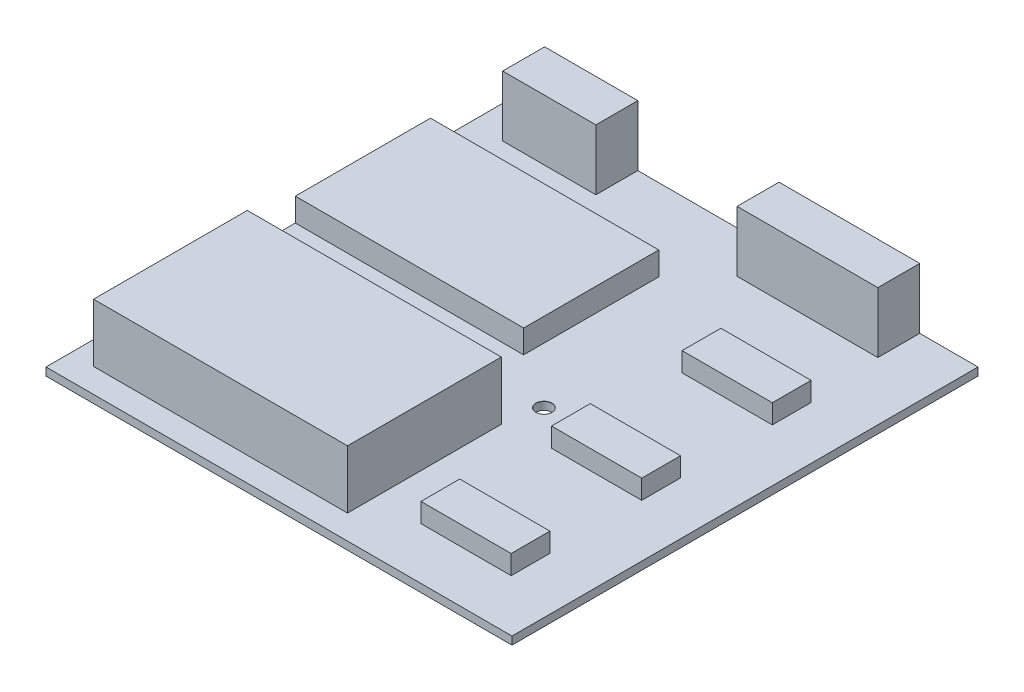
ISO-10303-21;
HEADER;
FILE_DESCRIPTION(('STEP AP214'),'2;1');
FILE_NAME('part.step','',(''),(''),'','','');
FILE_SCHEMA(('AUTOMOTIVE_DESIGN { 1 0 10303 214 1 1 1 1 }'));
ENDSEC;
DATA;
#1=APPLICATION_CONTEXT('core data for automotive mechanical design processes');
#2=APPLICATION_PROTOCOL_DEFINITION('international standard','automotive_design',2000,#1);
#3=PRODUCT_CONTEXT('',#1,'mechanical');
#4=PRODUCT('Part','Part','',(#3));
#5=PRODUCT_RELATED_PRODUCT_CATEGORY('part','',(#4));
#6=PRODUCT_DEFINITION_FORMATION('','',#4);
#7=PRODUCT_DEFINITION_CONTEXT('part definition',#1,'design');
#8=PRODUCT_DEFINITION('design','',#6,#7);
#9=PRODUCT_DEFINITION_SHAPE('','',#8);
#10=(LENGTH_UNIT() NAMED_UNIT(*) SI_UNIT(.MILLI.,.METRE.));
#11=(NAMED_UNIT(*) PLANE_ANGLE_UNIT() SI_UNIT($,.RADIAN.));
#12=(NAMED_UNIT(*) SI_UNIT($,.STERADIAN.) SOLID_ANGLE_UNIT());
#13=UNCERTAINTY_MEASURE_WITH_UNIT(LENGTH_MEASURE(1.E-05),#10,'distance_accuracy_value','');
#14=(GEOMETRIC_REPRESENTATION_CONTEXT(3) GLOBAL_UNCERTAINTY_ASSIGNED_CONTEXT((#13)) GLOBAL_UNIT_ASSIGNED_CONTEXT((#10,
#11,#12)) REPRESENTATION_CONTEXT('',''));
#15=CARTESIAN_POINT('',(0.,0.,0.));
#16=DIRECTION('',(0.,0.,1.));
#17=DIRECTION('',(1.,0.,0.));
#18=AXIS2_PLACEMENT_3D('',#15,#16,#17);
#19=CARTESIAN_POINT('',(0.,1.7,0.));
#20=DIRECTION('',(0.,-1.,0.));
#21=DIRECTION('',(0.,0.,-1.));
#22=AXIS2_PLACEMENT_3D('',#19,#20,#21);
#23=PLANE('',#22);
#24=CARTESIAN_POINT('',(-37.,1.7,4.15));
#25=DIRECTION('',(0.,1.,0.));
#26=DIRECTION('',(0.,0.,1.));
#27=AXIS2_PLACEMENT_3D('',#24,#25,#26);
#28=CIRCLE('',#27,1.725);
#29=CARTESIAN_POINT('',(-37.,1.7,5.875));
#30=VERTEX_POINT('',#29);
#31=EDGE_CURVE('E890',#30,#30,#28,.T.);
#32=ORIENTED_EDGE('',*,*,#31,.F.);
#33=EDGE_LOOP('',(#32));
#34=FACE_BOUND('',#33,.T.);
#35=CARTESIAN_POINT('',(11.,1.7,4.15));
#36=DIRECTION('',(0.,1.,0.));
#37=DIRECTION('',(0.,0.,1.));
#38=AXIS2_PLACEMENT_3D('',#35,#36,#37);
#39=CIRCLE('',#38,1.725);
#40=CARTESIAN_POINT('',(11.,1.7,5.875));
#41=VERTEX_POINT('',#40);
#42=EDGE_CURVE('E897',#41,#41,#39,.T.);
#43=ORIENTED_EDGE('',*,*,#42,.F.);
#44=EDGE_LOOP('',(#43));
#45=FACE_BOUND('',#44,.T.);
#46=DIRECTION('',(0.,0.,1.));
#47=VECTOR('',#46,1.);
#48=CARTESIAN_POINT('',(19.34,1.7,30.56));
#49=LINE('',#48,#47);
#50=CARTESIAN_POINT('',(19.34,1.7,30.56));
#51=VERTEX_POINT('',#50);
#52=CARTESIAN_POINT('',(19.34,1.7,38.88));
#53=VERTEX_POINT('',#52);
#54=EDGE_CURVE('E263',#51,#53,#49,.T.);
#55=ORIENTED_EDGE('',*,*,#54,.F.);
#56=DIRECTION('',(-1.,0.,0.));
#57=VECTOR('',#56,1.);
#58=CARTESIAN_POINT('',(19.34,1.7,30.56));
#59=LINE('',#58,#57);
#60=CARTESIAN_POINT('',(38.7,1.7,30.56));
#61=VERTEX_POINT('',#60);
#62=EDGE_CURVE('E276',#61,#51,#59,.T.);
#63=ORIENTED_EDGE('',*,*,#62,.F.);
#64=DIRECTION('',(0.,0.,-1.));
#65=VECTOR('',#64,1.);
#66=CARTESIAN_POINT('',(38.7,1.7,30.56));
#67=LINE('',#66,#65);
#68=CARTESIAN_POINT('',(38.7,1.7,38.88));
#69=VERTEX_POINT('',#68);
#70=EDGE_CURVE('E285',#69,#61,#67,.T.);
#71=ORIENTED_EDGE('',*,*,#70,.F.);
#72=DIRECTION('',(1.,0.,0.));
#73=VECTOR('',#72,1.);
#74=CARTESIAN_POINT('',(19.34,1.7,38.88));
#75=LINE('',#74,#73);
#76=EDGE_CURVE('E266',#53,#69,#75,.T.);
#77=ORIENTED_EDGE('',*,*,#76,.F.);
#78=EDGE_LOOP('',(#55,#63,#71,#77));
#79=FACE_BOUND('',#78,.T.);
#80=DIRECTION('',(0.,0.,1.));
#81=VECTOR('',#80,1.);
#82=CARTESIAN_POINT('',(19.34,1.7,-25.48));
#83=LINE('',#82,#81);
#84=CARTESIAN_POINT('',(19.34,1.7,-25.48));
#85=VERTEX_POINT('',#84);
#86=CARTESIAN_POINT('',(19.34,1.7,-17.16));
#87=VERTEX_POINT('',#86);
#88=EDGE_CURVE('E334',#85,#87,#83,.T.);
#89=ORIENTED_EDGE('',*,*,#88,.F.);
#90=DIRECTION('',(-1.,0.,0.));
#91=VECTOR('',#90,1.);
#92=CARTESIAN_POINT('',(19.34,1.7,-25.48));
#93=LINE('',#92,#91);
#94=CARTESIAN_POINT('',(38.7,1.7,-25.48));
#95=VERTEX_POINT('',#94);
#96=EDGE_CURVE('E339',#95,#85,#93,.T.);
#97=ORIENTED_EDGE('',*,*,#96,.F.);
#98=DIRECTION('',(0.,0.,-1.));
#99=VECTOR('',#98,1.);
#100=CARTESIAN_POINT('',(38.7,1.7,-25.48));
#101=LINE('',#100,#99);
#102=CARTESIAN_POINT('',(38.7,1.7,-17.16));
#103=VERTEX_POINT('',#102);
#104=EDGE_CURVE('E351',#103,#95,#101,.T.);
#105=ORIENTED_EDGE('',*,*,#104,.F.);
#106=DIRECTION('',(1.,0.,0.));
#107=VECTOR('',#106,1.);
#108=CARTESIAN_POINT('',(19.34,1.7,-17.16));
#109=LINE('',#108,#107);
#110=EDGE_CURVE('E348',#87,#103,#109,.T.);
#111=ORIENTED_EDGE('',*,*,#110,.F.);
#112=EDGE_LOOP('',(#89,#97,#105,#111));
#113=FACE_BOUND('',#112,.T.);
#114=DIRECTION('',(1.,0.,0.));
#115=VECTOR('',#114,1.);
#116=CARTESIAN_POINT('',(-50.,1.7,-3.5));
#117=LINE('',#116,#115);
#118=CARTESIAN_POINT('',(-50.,1.7,-3.5));
#119=VERTEX_POINT('',#118);
#120=CARTESIAN_POINT('',(-0.999999999999984,1.7,-3.5));
#121=VERTEX_POINT('',#120);
#122=EDGE_CURVE('E367',#119,#121,#117,.T.);
#123=ORIENTED_EDGE('',*,*,#122,.F.);
#124=DIRECTION('',(0.,0.,1.));
#125=VECTOR('',#124,1.);
#126=CARTESIAN_POINT('',(-50.,1.7,50.));
#127=LINE('',#126,#125);
#128=CARTESIAN_POINT('',(-50.,1.7,50.));
#129=VERTEX_POINT('',#128);
#130=EDGE_CURVE('E465',#119,#129,#127,.T.);
#131=ORIENTED_EDGE('',*,*,#130,.T.);
#132=DIRECTION('',(1.,0.,0.));
#133=VECTOR('',#132,1.);
#134=CARTESIAN_POINT('',(-50.,1.7,50.));
#135=LINE('',#134,#133);
#136=CARTESIAN_POINT('',(50.,1.7,50.));
#137=VERTEX_POINT('',#136);
#138=EDGE_CURVE('E469',#129,#137,#135,.T.);
#139=ORIENTED_EDGE('',*,*,#138,.T.);
#140=DIRECTION('',(0.,0.,-1.));
#141=VECTOR('',#140,1.);
#142=CARTESIAN_POINT('',(50.,1.7,50.));
#143=LINE('',#142,#141);
#144=CARTESIAN_POINT('',(50.,1.7,-50.));
#145=VERTEX_POINT('',#144);
#146=EDGE_CURVE('E458',#137,#145,#143,.T.);
#147=ORIENTED_EDGE('',*,*,#146,.T.);
#148=DIRECTION('',(-1.,0.,0.));
#149=VECTOR('',#148,1.);
#150=CARTESIAN_POINT('',(-50.,1.7,-50.));
#151=LINE('',#150,#149);
#152=CARTESIAN_POINT('',(37.5,1.7,-50.));
#153=VERTEX_POINT('',#152);
#154=EDGE_CURVE('E463',#145,#153,#151,.T.);
#155=ORIENTED_EDGE('',*,*,#154,.T.);
#156=DIRECTION('',(0.,0.,-1.));
#157=VECTOR('',#156,1.);
#158=CARTESIAN_POINT('',(37.5,1.7,-50.));
#159=LINE('',#158,#157);
#160=CARTESIAN_POINT('',(37.5,1.7,-41.));
#161=VERTEX_POINT('',#160);
#162=EDGE_CURVE('E432',#161,#153,#159,.T.);
#163=ORIENTED_EDGE('',*,*,#162,.F.);
#164=DIRECTION('',(1.,0.,0.));
#165=VECTOR('',#164,1.);
#166=CARTESIAN_POINT('',(7.30000000000002,1.7,-41.));
#167=LINE('',#166,#165);
#168=CARTESIAN_POINT('',(7.30000000000002,1.7,-41.));
#169=VERTEX_POINT('',#168);
#170=EDGE_CURVE('E441',#169,#161,#167,.T.);
#171=ORIENTED_EDGE('',*,*,#170,.F.);
#172=DIRECTION('',(0.,0.,1.));
#173=VECTOR('',#172,1.);
#174=CARTESIAN_POINT('',(7.30000000000002,1.7,-50.));
#175=LINE('',#174,#173);
#176=CARTESIAN_POINT('',(7.30000000000002,1.7,-50.));
#177=VERTEX_POINT('',#176);
#178=EDGE_CURVE('E427',#177,#169,#175,.T.);
#179=ORIENTED_EDGE('',*,*,#178,.F.);
#180=CARTESIAN_POINT('',(-23.,1.7,-50.));
#181=VERTEX_POINT('',#180);
#182=EDGE_CURVE('E466',#177,#181,#151,.T.);
#183=ORIENTED_EDGE('',*,*,#182,.T.);
#184=DIRECTION('',(0.,0.,-1.));
#185=VECTOR('',#184,1.);
#186=CARTESIAN_POINT('',(-23.,1.7,-50.));
#187=LINE('',#186,#185);
#188=CARTESIAN_POINT('',(-23.,1.7,-41.));
#189=VERTEX_POINT('',#188);
#190=EDGE_CURVE('E402',#189,#181,#187,.T.);
#191=ORIENTED_EDGE('',*,*,#190,.F.);
#192=DIRECTION('',(1.,0.,0.));
#193=VECTOR('',#192,1.);
#194=CARTESIAN_POINT('',(-43.,1.7,-41.));
#195=LINE('',#194,#193);
#196=CARTESIAN_POINT('',(-43.,1.7,-41.));
#197=VERTEX_POINT('',#196);
#198=EDGE_CURVE('E411',#197,#189,#195,.T.);
#199=ORIENTED_EDGE('',*,*,#198,.F.);
#200=DIRECTION('',(0.,0.,1.));
#201=VECTOR('',#200,1.);
#202=CARTESIAN_POINT('',(-43.,1.7,-50.));
#203=LINE('',#202,#201);
#204=CARTESIAN_POINT('',(-43.,1.7,-50.));
#205=VERTEX_POINT('',#204);
#206=EDGE_CURVE('E397',#205,#197,#203,.T.);
#207=ORIENTED_EDGE('',*,*,#206,.F.);
#208=CARTESIAN_POINT('',(-50.,1.7,-50.));
#209=VERTEX_POINT('',#208);
#210=EDGE_CURVE('E461',#205,#209,#151,.T.);
#211=ORIENTED_EDGE('',*,*,#210,.T.);
#212=CARTESIAN_POINT('',(-50.,1.7,-32.5));
#213=VERTEX_POINT('',#212);
#214=EDGE_CURVE('E467',#209,#213,#127,.T.);
#215=ORIENTED_EDGE('',*,*,#214,.T.);
#216=DIRECTION('',(-1.,0.,0.));
#217=VECTOR('',#216,1.);
#218=CARTESIAN_POINT('',(-50.,1.7,-32.5));
#219=LINE('',#218,#217);
#220=CARTESIAN_POINT('',(-0.999999999999987,1.7,-32.5));
#221=VERTEX_POINT('',#220);
#222=EDGE_CURVE('E372',#221,#213,#219,.T.);
#223=ORIENTED_EDGE('',*,*,#222,.F.);
#224=DIRECTION('',(0.,0.,-1.));
#225=VECTOR('',#224,1.);
#226=CARTESIAN_POINT('',(-0.999999999999987,1.7,-32.5));
#227=LINE('',#226,#225);
#228=EDGE_CURVE('E381',#121,#221,#227,.T.);
#229=ORIENTED_EDGE('',*,*,#228,.F.);
#230=EDGE_LOOP('',(#123,#131,#139,#147,#155,#163,#171,#179,#183,#191,#199,#207,#211,#215,#223,#229));
#231=FACE_BOUND('',#230,.T.);
#232=DIRECTION('',(0.,0.,1.));
#233=VECTOR('',#232,1.);
#234=CARTESIAN_POINT('',(19.34,1.7,10.86));
#235=LINE('',#234,#233);
#236=CARTESIAN_POINT('',(19.34,1.7,2.54));
#237=VERTEX_POINT('',#236);
#238=CARTESIAN_POINT('',(19.34,1.7,10.86));
#239=VERTEX_POINT('',#238);
#240=EDGE_CURVE('E301',#237,#239,#235,.T.);
#241=ORIENTED_EDGE('',*,*,#240,.F.);
#242=DIRECTION('',(-1.,0.,0.));
#243=VECTOR('',#242,1.);
#244=CARTESIAN_POINT('',(19.34,1.7,2.54));
#245=LINE('',#244,#243);
#246=CARTESIAN_POINT('',(38.7,1.7,2.54));
#247=VERTEX_POINT('',#246);
#248=EDGE_CURVE('E306',#247,#237,#245,.T.);
#249=ORIENTED_EDGE('',*,*,#248,.F.);
#250=DIRECTION('',(0.,0.,-1.));
#251=VECTOR('',#250,1.);
#252=CARTESIAN_POINT('',(38.7,1.7,10.86));
#253=LINE('',#252,#251);
#254=CARTESIAN_POINT('',(38.7,1.7,10.86));
#255=VERTEX_POINT('',#254);
#256=EDGE_CURVE('E318',#255,#247,#253,.T.);
#257=ORIENTED_EDGE('',*,*,#256,.F.);
#258=DIRECTION('',(1.,0.,0.));
#259=VECTOR('',#258,1.);
#260=CARTESIAN_POINT('',(19.34,1.7,10.86));
#261=LINE('',#260,#259);
#262=EDGE_CURVE('E315',#239,#255,#261,.T.);
#263=ORIENTED_EDGE('',*,*,#262,.F.);
#264=EDGE_LOOP('',(#241,#249,#257,#263));
#265=FACE_BOUND('',#264,.T.);
#266=DIRECTION('',(0.,0.,1.));
#267=VECTOR('',#266,1.);
#268=CARTESIAN_POINT('',(-45.,1.7,11.8));
#269=LINE('',#268,#267);
#270=CARTESIAN_POINT('',(-45.,1.7,11.8));
#271=VERTEX_POINT('',#270);
#272=CARTESIAN_POINT('',(-45.,1.7,44.8));
#273=VERTEX_POINT('',#272);
#274=EDGE_CURVE('E262',#271,#273,#269,.T.);
#275=ORIENTED_EDGE('',*,*,#274,.F.);
#276=DIRECTION('',(-1.,0.,0.));
#277=VECTOR('',#276,1.);
#278=CARTESIAN_POINT('',(-45.,1.7,11.8));
#279=LINE('',#278,#277);
#280=CARTESIAN_POINT('',(9.50000000000002,1.7,11.8));
#281=VERTEX_POINT('',#280);
#282=EDGE_CURVE('E259',#281,#271,#279,.T.);
#283=ORIENTED_EDGE('',*,*,#282,.F.);
#284=DIRECTION('',(0.,0.,-1.));
#285=VECTOR('',#284,1.);
#286=CARTESIAN_POINT('',(9.50000000000002,1.7,11.8));
#287=LINE('',#286,#285);
#288=CARTESIAN_POINT('',(9.50000000000002,1.7,44.8));
#289=VERTEX_POINT('',#288);
#290=EDGE_CURVE('E53',#289,#281,#287,.T.);
#291=ORIENTED_EDGE('',*,*,#290,.F.);
#292=DIRECTION('',(1.,0.,0.));
#293=VECTOR('',#292,1.);
#294=CARTESIAN_POINT('',(-45.,1.7,44.8));
#295=LINE('',#294,#293);
#296=EDGE_CURVE('E48',#273,#289,#295,.T.);
#297=ORIENTED_EDGE('',*,*,#296,.F.);
#298=EDGE_LOOP('',(#275,#283,#291,#297));
#299=FACE_BOUND('',#298,.T.);
#300=ADVANCED_FACE('F33',(#34,#45,#79,#113,#231,#265,#299),#23,.F.);
#301=CARTESIAN_POINT('',(50.,1.7,50.));
#302=DIRECTION('',(-1.,0.,0.));
#303=DIRECTION('',(0.,0.,1.));
#304=AXIS2_PLACEMENT_3D('',#301,#302,#303);
#305=PLANE('',#304);
#306=DIRECTION('',(0.,0.,-1.));
#307=VECTOR('',#306,1.);
#308=CARTESIAN_POINT('',(50.,0.,50.));
#309=LINE('',#308,#307);
#310=CARTESIAN_POINT('',(50.,0.,50.));
#311=VERTEX_POINT('',#310);
#312=CARTESIAN_POINT('',(50.,0.,-50.));
#313=VERTEX_POINT('',#312);
#314=EDGE_CURVE('E457',#311,#313,#309,.T.);
#315=ORIENTED_EDGE('',*,*,#314,.T.);
#316=DIRECTION('',(0.,-1.,0.));
#317=VECTOR('',#316,1.);
#318=CARTESIAN_POINT('',(50.,1.7,-50.));
#319=LINE('',#318,#317);
#320=EDGE_CURVE('E11',#145,#313,#319,.T.);
#321=ORIENTED_EDGE('',*,*,#320,.F.);
#322=ORIENTED_EDGE('',*,*,#146,.F.);
#323=DIRECTION('',(0.,-1.,0.));
#324=VECTOR('',#323,1.);
#325=CARTESIAN_POINT('',(50.,1.7,50.));
#326=LINE('',#325,#324);
#327=EDGE_CURVE('E471',#137,#311,#326,.T.);
#328=ORIENTED_EDGE('',*,*,#327,.T.);
#329=EDGE_LOOP('',(#315,#321,#322,#328));
#330=FACE_BOUND('',#329,.T.);
#331=ADVANCED_FACE('F35',(#330),#305,.F.);
#332=CARTESIAN_POINT('',(-50.,1.7,-50.));
#333=DIRECTION('',(0.,0.,1.));
#334=DIRECTION('',(1.,0.,0.));
#335=AXIS2_PLACEMENT_3D('',#332,#333,#334);
#336=PLANE('',#335);
#337=DIRECTION('',(-1.,0.,0.));
#338=VECTOR('',#337,1.);
#339=CARTESIAN_POINT('',(-50.,0.,-50.));
#340=LINE('',#339,#338);
#341=CARTESIAN_POINT('',(-50.,0.,-50.));
#342=VERTEX_POINT('',#341);
#343=EDGE_CURVE('E474',#313,#342,#340,.T.);
#344=ORIENTED_EDGE('',*,*,#343,.T.);
#345=DIRECTION('',(0.,-1.,0.));
#346=VECTOR('',#345,1.);
#347=CARTESIAN_POINT('',(-50.,1.7,-50.));
#348=LINE('',#347,#346);
#349=EDGE_CURVE('E41',#209,#342,#348,.T.);
#350=ORIENTED_EDGE('',*,*,#349,.F.);
#351=ORIENTED_EDGE('',*,*,#210,.F.);
#352=DIRECTION('',(0.,-1.,0.));
#353=VECTOR('',#352,1.);
#354=CARTESIAN_POINT('',(-43.,14.7,-50.));
#355=LINE('',#354,#353);
#356=CARTESIAN_POINT('',(-43.,14.7,-50.));
#357=VERTEX_POINT('',#356);
#358=EDGE_CURVE('E408',#357,#205,#355,.T.);
#359=ORIENTED_EDGE('',*,*,#358,.F.);
#360=DIRECTION('',(-1.,0.,0.));
#361=VECTOR('',#360,1.);
#362=CARTESIAN_POINT('',(-43.,14.7,-50.));
#363=LINE('',#362,#361);
#364=CARTESIAN_POINT('',(-23.,14.7,-50.));
#365=VERTEX_POINT('',#364);
#366=EDGE_CURVE('E406',#365,#357,#363,.T.);
#367=ORIENTED_EDGE('',*,*,#366,.F.);
#368=DIRECTION('',(0.,-1.,0.));
#369=VECTOR('',#368,1.);
#370=CARTESIAN_POINT('',(-23.,14.7,-50.));
#371=LINE('',#370,#369);
#372=EDGE_CURVE('E418',#365,#181,#371,.T.);
#373=ORIENTED_EDGE('',*,*,#372,.T.);
#374=ORIENTED_EDGE('',*,*,#182,.F.);
#375=DIRECTION('',(0.,-1.,0.));
#376=VECTOR('',#375,1.);
#377=CARTESIAN_POINT('',(7.30000000000002,14.7,-50.));
#378=LINE('',#377,#376);
#379=CARTESIAN_POINT('',(7.30000000000002,14.7,-50.));
#380=VERTEX_POINT('',#379);
#381=EDGE_CURVE('E438',#380,#177,#378,.T.);
#382=ORIENTED_EDGE('',*,*,#381,.F.);
#383=DIRECTION('',(-1.,0.,0.));
#384=VECTOR('',#383,1.);
#385=CARTESIAN_POINT('',(7.30000000000002,14.7,-50.));
#386=LINE('',#385,#384);
#387=CARTESIAN_POINT('',(37.5,14.7,-50.));
#388=VERTEX_POINT('',#387);
#389=EDGE_CURVE('E436',#388,#380,#386,.T.);
#390=ORIENTED_EDGE('',*,*,#389,.F.);
#391=DIRECTION('',(0.,-1.,0.));
#392=VECTOR('',#391,1.);
#393=CARTESIAN_POINT('',(37.5,14.7,-50.));
#394=LINE('',#393,#392);
#395=EDGE_CURVE('E448',#388,#153,#394,.T.);
#396=ORIENTED_EDGE('',*,*,#395,.T.);
#397=ORIENTED_EDGE('',*,*,#154,.F.);
#398=ORIENTED_EDGE('',*,*,#320,.T.);
#399=EDGE_LOOP('',(#344,#350,#351,#359,#367,#373,#374,#382,#390,#396,#397,#398));
#400=FACE_BOUND('',#399,.T.);
#401=ADVANCED_FACE('F537',(#400),#336,.F.);
#402=CARTESIAN_POINT('',(-50.,1.7,50.));
#403=DIRECTION('',(1.,0.,0.));
#404=DIRECTION('',(0.,0.,-1.));
#405=AXIS2_PLACEMENT_3D('',#402,#403,#404);
#406=PLANE('',#405);
#407=DIRECTION('',(0.,0.,1.));
#408=VECTOR('',#407,1.);
#409=CARTESIAN_POINT('',(-50.,0.,50.));
#410=LINE('',#409,#408);
#411=CARTESIAN_POINT('',(-50.,0.,50.));
#412=VERTEX_POINT('',#411);
#413=EDGE_CURVE('E476',#342,#412,#410,.T.);
#414=ORIENTED_EDGE('',*,*,#413,.T.);
#415=DIRECTION('',(0.,-1.,0.));
#416=VECTOR('',#415,1.);
#417=CARTESIAN_POINT('',(-50.,1.7,50.));
#418=LINE('',#417,#416);
#419=EDGE_CURVE('E481',#129,#412,#418,.T.);
#420=ORIENTED_EDGE('',*,*,#419,.F.);
#421=ORIENTED_EDGE('',*,*,#130,.F.);
#422=DIRECTION('',(0.,-1.,0.));
#423=VECTOR('',#422,1.);
#424=CARTESIAN_POINT('',(-50.,6.7,-3.5));
#425=LINE('',#424,#423);
#426=CARTESIAN_POINT('',(-50.,6.7,-3.5));
#427=VERTEX_POINT('',#426);
#428=EDGE_CURVE('E394',#427,#119,#425,.T.);
#429=ORIENTED_EDGE('',*,*,#428,.F.);
#430=DIRECTION('',(0.,0.,1.));
#431=VECTOR('',#430,1.);
#432=CARTESIAN_POINT('',(-50.,6.7,-32.5));
#433=LINE('',#432,#431);
#434=CARTESIAN_POINT('',(-50.,6.7,-32.5));
#435=VERTEX_POINT('',#434);
#436=EDGE_CURVE('E368',#435,#427,#433,.T.);
#437=ORIENTED_EDGE('',*,*,#436,.F.);
#438=DIRECTION('',(0.,-1.,0.));
#439=VECTOR('',#438,1.);
#440=CARTESIAN_POINT('',(-50.,6.7,-32.5));
#441=LINE('',#440,#439);
#442=EDGE_CURVE('E378',#435,#213,#441,.T.);
#443=ORIENTED_EDGE('',*,*,#442,.T.);
#444=ORIENTED_EDGE('',*,*,#214,.F.);
#445=ORIENTED_EDGE('',*,*,#349,.T.);
#446=EDGE_LOOP('',(#414,#420,#421,#429,#437,#443,#444,#445));
#447=FACE_BOUND('',#446,.T.);
#448=ADVANCED_FACE('F488',(#447),#406,.F.);
#449=CARTESIAN_POINT('',(-50.,1.7,50.));
#450=DIRECTION('',(0.,0.,-1.));
#451=DIRECTION('',(-1.,0.,0.));
#452=AXIS2_PLACEMENT_3D('',#449,#450,#451);
#453=PLANE('',#452);
#454=DIRECTION('',(1.,0.,0.));
#455=VECTOR('',#454,1.);
#456=CARTESIAN_POINT('',(-50.,0.,50.));
#457=LINE('',#456,#455);
#458=EDGE_CURVE('E462',#412,#311,#457,.T.);
#459=ORIENTED_EDGE('',*,*,#458,.T.);
#460=ORIENTED_EDGE('',*,*,#327,.F.);
#461=ORIENTED_EDGE('',*,*,#138,.F.);
#462=ORIENTED_EDGE('',*,*,#419,.T.);
#463=EDGE_LOOP('',(#459,#460,#461,#462));
#464=FACE_BOUND('',#463,.T.);
#465=ADVANCED_FACE('F497',(#464),#453,.F.);
#466=CARTESIAN_POINT('',(0.,0.,0.));
#467=DIRECTION('',(0.,-1.,0.));
#468=DIRECTION('',(0.,0.,-1.));
#469=AXIS2_PLACEMENT_3D('',#466,#467,#468);
#470=PLANE('',#469);
#471=CARTESIAN_POINT('',(-37.,0.,4.15));
#472=DIRECTION('',(0.,1.,0.));
#473=DIRECTION('',(0.,0.,1.));
#474=AXIS2_PLACEMENT_3D('',#471,#472,#473);
#475=CIRCLE('',#474,1.7);
#476=CARTESIAN_POINT('',(-37.,0.,5.85));
#477=VERTEX_POINT('',#476);
#478=EDGE_CURVE('E892',#477,#477,#475,.T.);
#479=ORIENTED_EDGE('',*,*,#478,.T.);
#480=EDGE_LOOP('',(#479));
#481=FACE_BOUND('',#480,.T.);
#482=CARTESIAN_POINT('',(11.,0.,4.15));
#483=DIRECTION('',(0.,1.,0.));
#484=DIRECTION('',(0.,0.,1.));
#485=AXIS2_PLACEMENT_3D('',#482,#483,#484);
#486=CIRCLE('',#485,1.7);
#487=CARTESIAN_POINT('',(11.,0.,5.85));
#488=VERTEX_POINT('',#487);
#489=EDGE_CURVE('E903',#488,#488,#486,.T.);
#490=ORIENTED_EDGE('',*,*,#489,.T.);
#491=EDGE_LOOP('',(#490));
#492=FACE_BOUND('',#491,.T.);
#493=ORIENTED_EDGE('',*,*,#314,.F.);
#494=ORIENTED_EDGE('',*,*,#458,.F.);
#495=ORIENTED_EDGE('',*,*,#413,.F.);
#496=ORIENTED_EDGE('',*,*,#343,.F.);
#497=EDGE_LOOP('',(#493,#494,#495,#496));
#498=FACE_BOUND('',#497,.T.);
#499=ADVANCED_FACE('F494',(#481,#492,#498),#470,.T.);
#500=CARTESIAN_POINT('',(7.30000000000002,14.7,-50.));
#501=DIRECTION('',(1.,0.,0.));
#502=DIRECTION('',(0.,0.,-1.));
#503=AXIS2_PLACEMENT_3D('',#500,#501,#502);
#504=PLANE('',#503);
#505=ORIENTED_EDGE('',*,*,#178,.T.);
#506=DIRECTION('',(0.,-1.,0.));
#507=VECTOR('',#506,1.);
#508=CARTESIAN_POINT('',(7.30000000000002,14.7,-41.));
#509=LINE('',#508,#507);
#510=CARTESIAN_POINT('',(7.30000000000002,14.7,-41.));
#511=VERTEX_POINT('',#510);
#512=EDGE_CURVE('E454',#511,#169,#509,.T.);
#513=ORIENTED_EDGE('',*,*,#512,.F.);
#514=DIRECTION('',(0.,0.,1.));
#515=VECTOR('',#514,1.);
#516=CARTESIAN_POINT('',(7.30000000000002,14.7,-50.));
#517=LINE('',#516,#515);
#518=EDGE_CURVE('E428',#380,#511,#517,.T.);
#519=ORIENTED_EDGE('',*,*,#518,.F.);
#520=ORIENTED_EDGE('',*,*,#381,.T.);
#521=EDGE_LOOP('',(#505,#513,#519,#520));
#522=FACE_BOUND('',#521,.T.);
#523=ADVANCED_FACE('F542',(#522),#504,.F.);
#524=CARTESIAN_POINT('',(7.30000000000002,14.7,-41.));
#525=DIRECTION('',(0.,0.,-1.));
#526=DIRECTION('',(-1.,0.,0.));
#527=AXIS2_PLACEMENT_3D('',#524,#525,#526);
#528=PLANE('',#527);
#529=ORIENTED_EDGE('',*,*,#170,.T.);
#530=DIRECTION('',(0.,-1.,0.));
#531=VECTOR('',#530,1.);
#532=CARTESIAN_POINT('',(37.5,14.7,-41.));
#533=LINE('',#532,#531);
#534=CARTESIAN_POINT('',(37.5,14.7,-41.));
#535=VERTEX_POINT('',#534);
#536=EDGE_CURVE('E451',#535,#161,#533,.T.);
#537=ORIENTED_EDGE('',*,*,#536,.F.);
#538=DIRECTION('',(1.,0.,0.));
#539=VECTOR('',#538,1.);
#540=CARTESIAN_POINT('',(7.30000000000002,14.7,-41.));
#541=LINE('',#540,#539);
#542=EDGE_CURVE('E431',#511,#535,#541,.T.);
#543=ORIENTED_EDGE('',*,*,#542,.F.);
#544=ORIENTED_EDGE('',*,*,#512,.T.);
#545=EDGE_LOOP('',(#529,#537,#543,#544));
#546=FACE_BOUND('',#545,.T.);
#547=ADVANCED_FACE('F560',(#546),#528,.F.);
#548=CARTESIAN_POINT('',(37.5,14.7,-50.));
#549=DIRECTION('',(-1.,0.,0.));
#550=DIRECTION('',(0.,0.,1.));
#551=AXIS2_PLACEMENT_3D('',#548,#549,#550);
#552=PLANE('',#551);
#553=ORIENTED_EDGE('',*,*,#162,.T.);
#554=ORIENTED_EDGE('',*,*,#395,.F.);
#555=DIRECTION('',(0.,0.,-1.));
#556=VECTOR('',#555,1.);
#557=CARTESIAN_POINT('',(37.5,14.7,-50.));
#558=LINE('',#557,#556);
#559=EDGE_CURVE('E434',#535,#388,#558,.T.);
#560=ORIENTED_EDGE('',*,*,#559,.F.);
#561=ORIENTED_EDGE('',*,*,#536,.T.);
#562=EDGE_LOOP('',(#553,#554,#560,#561));
#563=FACE_BOUND('',#562,.T.);
#564=ADVANCED_FACE('F557',(#563),#552,.F.);
#565=CARTESIAN_POINT('',(0.,14.7,0.));
#566=DIRECTION('',(0.,1.,0.));
#567=DIRECTION('',(0.,0.,1.));
#568=AXIS2_PLACEMENT_3D('',#565,#566,#567);
#569=PLANE('',#568);
#570=ORIENTED_EDGE('',*,*,#518,.T.);
#571=ORIENTED_EDGE('',*,*,#542,.T.);
#572=ORIENTED_EDGE('',*,*,#559,.T.);
#573=ORIENTED_EDGE('',*,*,#389,.T.);
#574=EDGE_LOOP('',(#570,#571,#572,#573));
#575=FACE_BOUND('',#574,.T.);
#576=ADVANCED_FACE('F587',(#575),#569,.T.);
#577=CARTESIAN_POINT('',(-43.,14.7,-50.));
#578=DIRECTION('',(1.,0.,0.));
#579=DIRECTION('',(0.,0.,-1.));
#580=AXIS2_PLACEMENT_3D('',#577,#578,#579);
#581=PLANE('',#580);
#582=ORIENTED_EDGE('',*,*,#206,.T.);
#583=DIRECTION('',(0.,-1.,0.));
#584=VECTOR('',#583,1.);
#585=CARTESIAN_POINT('',(-43.,14.7,-41.));
#586=LINE('',#585,#584);
#587=CARTESIAN_POINT('',(-43.,14.7,-41.));
#588=VERTEX_POINT('',#587);
#589=EDGE_CURVE('E424',#588,#197,#586,.T.);
#590=ORIENTED_EDGE('',*,*,#589,.F.);
#591=DIRECTION('',(0.,0.,1.));
#592=VECTOR('',#591,1.);
#593=CARTESIAN_POINT('',(-43.,14.7,-50.));
#594=LINE('',#593,#592);
#595=EDGE_CURVE('E398',#357,#588,#594,.T.);
#596=ORIENTED_EDGE('',*,*,#595,.F.);
#597=ORIENTED_EDGE('',*,*,#358,.T.);
#598=EDGE_LOOP('',(#582,#590,#596,#597));
#599=FACE_BOUND('',#598,.T.);
#600=ADVANCED_FACE('F572',(#599),#581,.F.);
#601=CARTESIAN_POINT('',(-43.,14.7,-41.));
#602=DIRECTION('',(0.,0.,-1.));
#603=DIRECTION('',(-1.,0.,0.));
#604=AXIS2_PLACEMENT_3D('',#601,#602,#603);
#605=PLANE('',#604);
#606=ORIENTED_EDGE('',*,*,#198,.T.);
#607=DIRECTION('',(0.,-1.,0.));
#608=VECTOR('',#607,1.);
#609=CARTESIAN_POINT('',(-23.,14.7,-41.));
#610=LINE('',#609,#608);
#611=CARTESIAN_POINT('',(-23.,14.7,-41.));
#612=VERTEX_POINT('',#611);
#613=EDGE_CURVE('E421',#612,#189,#610,.T.);
#614=ORIENTED_EDGE('',*,*,#613,.F.);
#615=DIRECTION('',(1.,0.,0.));
#616=VECTOR('',#615,1.);
#617=CARTESIAN_POINT('',(-43.,14.7,-41.));
#618=LINE('',#617,#616);
#619=EDGE_CURVE('E401',#588,#612,#618,.T.);
#620=ORIENTED_EDGE('',*,*,#619,.F.);
#621=ORIENTED_EDGE('',*,*,#589,.T.);
#622=EDGE_LOOP('',(#606,#614,#620,#621));
#623=FACE_BOUND('',#622,.T.);
#624=ADVANCED_FACE('F579',(#623),#605,.F.);
#625=CARTESIAN_POINT('',(-23.,14.7,-50.));
#626=DIRECTION('',(-1.,0.,0.));
#627=DIRECTION('',(0.,0.,1.));
#628=AXIS2_PLACEMENT_3D('',#625,#626,#627);
#629=PLANE('',#628);
#630=ORIENTED_EDGE('',*,*,#190,.T.);
#631=ORIENTED_EDGE('',*,*,#372,.F.);
#632=DIRECTION('',(0.,0.,-1.));
#633=VECTOR('',#632,1.);
#634=CARTESIAN_POINT('',(-23.,14.7,-50.));
#635=LINE('',#634,#633);
#636=EDGE_CURVE('E404',#612,#365,#635,.T.);
#637=ORIENTED_EDGE('',*,*,#636,.F.);
#638=ORIENTED_EDGE('',*,*,#613,.T.);
#639=EDGE_LOOP('',(#630,#631,#637,#638));
#640=FACE_BOUND('',#639,.T.);
#641=ADVANCED_FACE('F577',(#640),#629,.F.);
#642=CARTESIAN_POINT('',(0.,14.7,0.));
#643=DIRECTION('',(0.,1.,0.));
#644=DIRECTION('',(0.,0.,1.));
#645=AXIS2_PLACEMENT_3D('',#642,#643,#644);
#646=PLANE('',#645);
#647=ORIENTED_EDGE('',*,*,#595,.T.);
#648=ORIENTED_EDGE('',*,*,#619,.T.);
#649=ORIENTED_EDGE('',*,*,#636,.T.);
#650=ORIENTED_EDGE('',*,*,#366,.T.);
#651=EDGE_LOOP('',(#647,#648,#649,#650));
#652=FACE_BOUND('',#651,.T.);
#653=ADVANCED_FACE('F527',(#652),#646,.T.);
#654=CARTESIAN_POINT('',(-50.,6.7,-3.5));
#655=DIRECTION('',(0.,0.,-1.));
#656=DIRECTION('',(-1.,0.,0.));
#657=AXIS2_PLACEMENT_3D('',#654,#655,#656);
#658=PLANE('',#657);
#659=ORIENTED_EDGE('',*,*,#122,.T.);
#660=DIRECTION('',(0.,-1.,0.));
#661=VECTOR('',#660,1.);
#662=CARTESIAN_POINT('',(-0.999999999999984,6.7,-3.5));
#663=LINE('',#662,#661);
#664=CARTESIAN_POINT('',(-0.999999999999984,6.7,-3.5));
#665=VERTEX_POINT('',#664);
#666=EDGE_CURVE('E391',#665,#121,#663,.T.);
#667=ORIENTED_EDGE('',*,*,#666,.F.);
#668=DIRECTION('',(1.,0.,0.));
#669=VECTOR('',#668,1.);
#670=CARTESIAN_POINT('',(-50.,6.7,-3.5));
#671=LINE('',#670,#669);
#672=EDGE_CURVE('E371',#427,#665,#671,.T.);
#673=ORIENTED_EDGE('',*,*,#672,.F.);
#674=ORIENTED_EDGE('',*,*,#428,.T.);
#675=EDGE_LOOP('',(#659,#667,#673,#674));
#676=FACE_BOUND('',#675,.T.);
#677=ADVANCED_FACE('F508',(#676),#658,.F.);
#678=CARTESIAN_POINT('',(-0.999999999999987,6.7,-32.5));
#679=DIRECTION('',(-1.,0.,0.));
#680=DIRECTION('',(0.,0.,1.));
#681=AXIS2_PLACEMENT_3D('',#678,#679,#680);
#682=PLANE('',#681);
#683=ORIENTED_EDGE('',*,*,#228,.T.);
#684=DIRECTION('',(0.,-1.,0.));
#685=VECTOR('',#684,1.);
#686=CARTESIAN_POINT('',(-0.999999999999987,6.7,-32.5));
#687=LINE('',#686,#685);
#688=CARTESIAN_POINT('',(-0.999999999999987,6.7,-32.5));
#689=VERTEX_POINT('',#688);
#690=EDGE_CURVE('E388',#689,#221,#687,.T.);
#691=ORIENTED_EDGE('',*,*,#690,.F.);
#692=DIRECTION('',(0.,0.,-1.));
#693=VECTOR('',#692,1.);
#694=CARTESIAN_POINT('',(-0.999999999999987,6.7,-32.5));
#695=LINE('',#694,#693);
#696=EDGE_CURVE('E374',#665,#689,#695,.T.);
#697=ORIENTED_EDGE('',*,*,#696,.F.);
#698=ORIENTED_EDGE('',*,*,#666,.T.);
#699=EDGE_LOOP('',(#683,#691,#697,#698));
#700=FACE_BOUND('',#699,.T.);
#701=ADVANCED_FACE('F519',(#700),#682,.F.);
#702=CARTESIAN_POINT('',(-50.,6.7,-32.5));
#703=DIRECTION('',(0.,0.,1.));
#704=DIRECTION('',(1.,0.,0.));
#705=AXIS2_PLACEMENT_3D('',#702,#703,#704);
#706=PLANE('',#705);
#707=ORIENTED_EDGE('',*,*,#222,.T.);
#708=ORIENTED_EDGE('',*,*,#442,.F.);
#709=DIRECTION('',(-1.,0.,0.));
#710=VECTOR('',#709,1.);
#711=CARTESIAN_POINT('',(-50.,6.7,-32.5));
#712=LINE('',#711,#710);
#713=EDGE_CURVE('E376',#689,#435,#712,.T.);
#714=ORIENTED_EDGE('',*,*,#713,.F.);
#715=ORIENTED_EDGE('',*,*,#690,.T.);
#716=EDGE_LOOP('',(#707,#708,#714,#715));
#717=FACE_BOUND('',#716,.T.);
#718=ADVANCED_FACE('F517',(#717),#706,.F.);
#719=CARTESIAN_POINT('',(0.,6.7,0.));
#720=DIRECTION('',(0.,1.,0.));
#721=DIRECTION('',(0.,0.,1.));
#722=AXIS2_PLACEMENT_3D('',#719,#720,#721);
#723=PLANE('',#722);
#724=ORIENTED_EDGE('',*,*,#436,.T.);
#725=ORIENTED_EDGE('',*,*,#672,.T.);
#726=ORIENTED_EDGE('',*,*,#696,.T.);
#727=ORIENTED_EDGE('',*,*,#713,.T.);
#728=EDGE_LOOP('',(#724,#725,#726,#727));
#729=FACE_BOUND('',#728,.T.);
#730=ADVANCED_FACE('F512',(#729),#723,.T.);
#731=CARTESIAN_POINT('',(19.34,5.83,-25.48));
#732=DIRECTION('',(1.,0.,0.));
#733=DIRECTION('',(0.,0.,-1.));
#734=AXIS2_PLACEMENT_3D('',#731,#732,#733);
#735=PLANE('',#734);
#736=ORIENTED_EDGE('',*,*,#88,.T.);
#737=DIRECTION('',(0.,-1.,0.));
#738=VECTOR('',#737,1.);
#739=CARTESIAN_POINT('',(19.34,5.83,-17.16));
#740=LINE('',#739,#738);
#741=CARTESIAN_POINT('',(19.34,5.83,-17.16));
#742=VERTEX_POINT('',#741);
#743=EDGE_CURVE('E364',#742,#87,#740,.T.);
#744=ORIENTED_EDGE('',*,*,#743,.F.);
#745=DIRECTION('',(0.,0.,1.));
#746=VECTOR('',#745,1.);
#747=CARTESIAN_POINT('',(19.34,5.83,-25.48));
#748=LINE('',#747,#746);
#749=CARTESIAN_POINT('',(19.34,5.83,-25.48));
#750=VERTEX_POINT('',#749);
#751=EDGE_CURVE('E335',#750,#742,#748,.T.);
#752=ORIENTED_EDGE('',*,*,#751,.F.);
#753=DIRECTION('',(0.,-1.,0.));
#754=VECTOR('',#753,1.);
#755=CARTESIAN_POINT('',(19.34,5.83,-25.48));
#756=LINE('',#755,#754);
#757=EDGE_CURVE('E345',#750,#85,#756,.T.);
#758=ORIENTED_EDGE('',*,*,#757,.T.);
#759=EDGE_LOOP('',(#736,#744,#752,#758));
#760=FACE_BOUND('',#759,.T.);
#761=ADVANCED_FACE('F649',(#760),#735,.F.);
#762=CARTESIAN_POINT('',(19.34,5.83,-17.16));
#763=DIRECTION('',(0.,0.,-1.));
#764=DIRECTION('',(-1.,0.,0.));
#765=AXIS2_PLACEMENT_3D('',#762,#763,#764);
#766=PLANE('',#765);
#767=ORIENTED_EDGE('',*,*,#110,.T.);
#768=DIRECTION('',(0.,-1.,0.));
#769=VECTOR('',#768,1.);
#770=CARTESIAN_POINT('',(38.7,5.83,-17.16));
#771=LINE('',#770,#769);
#772=CARTESIAN_POINT('',(38.7,5.83,-17.16));
#773=VERTEX_POINT('',#772);
#774=EDGE_CURVE('E361',#773,#103,#771,.T.);
#775=ORIENTED_EDGE('',*,*,#774,.F.);
#776=DIRECTION('',(1.,0.,0.));
#777=VECTOR('',#776,1.);
#778=CARTESIAN_POINT('',(19.34,5.83,-17.16));
#779=LINE('',#778,#777);
#780=EDGE_CURVE('E338',#742,#773,#779,.T.);
#781=ORIENTED_EDGE('',*,*,#780,.F.);
#782=ORIENTED_EDGE('',*,*,#743,.T.);
#783=EDGE_LOOP('',(#767,#775,#781,#782));
#784=FACE_BOUND('',#783,.T.);
#785=ADVANCED_FACE('F658',(#784),#766,.F.);
#786=CARTESIAN_POINT('',(38.7,5.83,-25.48));
#787=DIRECTION('',(-1.,0.,0.));
#788=DIRECTION('',(0.,0.,1.));
#789=AXIS2_PLACEMENT_3D('',#786,#787,#788);
#790=PLANE('',#789);
#791=ORIENTED_EDGE('',*,*,#104,.T.);
#792=DIRECTION('',(0.,-1.,0.));
#793=VECTOR('',#792,1.);
#794=CARTESIAN_POINT('',(38.7,5.83,-25.48));
#795=LINE('',#794,#793);
#796=CARTESIAN_POINT('',(38.7,5.83,-25.48));
#797=VERTEX_POINT('',#796);
#798=EDGE_CURVE('E358',#797,#95,#795,.T.);
#799=ORIENTED_EDGE('',*,*,#798,.F.);
#800=DIRECTION('',(0.,0.,-1.));
#801=VECTOR('',#800,1.);
#802=CARTESIAN_POINT('',(38.7,5.83,-25.48));
#803=LINE('',#802,#801);
#804=EDGE_CURVE('E341',#773,#797,#803,.T.);
#805=ORIENTED_EDGE('',*,*,#804,.F.);
#806=ORIENTED_EDGE('',*,*,#774,.T.);
#807=EDGE_LOOP('',(#791,#799,#805,#806));
#808=FACE_BOUND('',#807,.T.);
#809=ADVANCED_FACE('F668',(#808),#790,.F.);
#810=CARTESIAN_POINT('',(19.34,5.83,-25.48));
#811=DIRECTION('',(0.,0.,1.));
#812=DIRECTION('',(1.,0.,0.));
#813=AXIS2_PLACEMENT_3D('',#810,#811,#812);
#814=PLANE('',#813);
#815=ORIENTED_EDGE('',*,*,#96,.T.);
#816=ORIENTED_EDGE('',*,*,#757,.F.);
#817=DIRECTION('',(-1.,0.,0.));
#818=VECTOR('',#817,1.);
#819=CARTESIAN_POINT('',(19.34,5.83,-25.48));
#820=LINE('',#819,#818);
#821=EDGE_CURVE('E343',#797,#750,#820,.T.);
#822=ORIENTED_EDGE('',*,*,#821,.F.);
#823=ORIENTED_EDGE('',*,*,#798,.T.);
#824=EDGE_LOOP('',(#815,#816,#822,#823));
#825=FACE_BOUND('',#824,.T.);
#826=ADVANCED_FACE('F678',(#825),#814,.F.);
#827=CARTESIAN_POINT('',(0.,5.83,0.));
#828=DIRECTION('',(0.,1.,0.));
#829=DIRECTION('',(0.,0.,1.));
#830=AXIS2_PLACEMENT_3D('',#827,#828,#829);
#831=PLANE('',#830);
#832=ORIENTED_EDGE('',*,*,#751,.T.);
#833=ORIENTED_EDGE('',*,*,#780,.T.);
#834=ORIENTED_EDGE('',*,*,#804,.T.);
#835=ORIENTED_EDGE('',*,*,#821,.T.);
#836=EDGE_LOOP('',(#832,#833,#834,#835));
#837=FACE_BOUND('',#836,.T.);
#838=ADVANCED_FACE('F688',(#837),#831,.T.);
#839=CARTESIAN_POINT('',(19.34,5.83,10.86));
#840=DIRECTION('',(1.,0.,0.));
#841=DIRECTION('',(0.,0.,-1.));
#842=AXIS2_PLACEMENT_3D('',#839,#840,#841);
#843=PLANE('',#842);
#844=ORIENTED_EDGE('',*,*,#240,.T.);
#845=DIRECTION('',(0.,-1.,0.));
#846=VECTOR('',#845,1.);
#847=CARTESIAN_POINT('',(19.34,5.83,10.86));
#848=LINE('',#847,#846);
#849=CARTESIAN_POINT('',(19.34,5.83,10.86));
#850=VERTEX_POINT('',#849);
#851=EDGE_CURVE('E331',#850,#239,#848,.T.);
#852=ORIENTED_EDGE('',*,*,#851,.F.);
#853=DIRECTION('',(0.,0.,1.));
#854=VECTOR('',#853,1.);
#855=CARTESIAN_POINT('',(19.34,5.83,10.86));
#856=LINE('',#855,#854);
#857=CARTESIAN_POINT('',(19.34,5.83,2.54));
#858=VERTEX_POINT('',#857);
#859=EDGE_CURVE('E302',#858,#850,#856,.T.);
#860=ORIENTED_EDGE('',*,*,#859,.F.);
#861=DIRECTION('',(0.,-1.,0.));
#862=VECTOR('',#861,1.);
#863=CARTESIAN_POINT('',(19.34,5.83,2.54));
#864=LINE('',#863,#862);
#865=EDGE_CURVE('E312',#858,#237,#864,.T.);
#866=ORIENTED_EDGE('',*,*,#865,.T.);
#867=EDGE_LOOP('',(#844,#852,#860,#866));
#868=FACE_BOUND('',#867,.T.);
#869=ADVANCED_FACE('F698',(#868),#843,.F.);
#870=CARTESIAN_POINT('',(19.34,5.83,10.86));
#871=DIRECTION('',(0.,0.,-1.));
#872=DIRECTION('',(-1.,0.,0.));
#873=AXIS2_PLACEMENT_3D('',#870,#871,#872);
#874=PLANE('',#873);
#875=ORIENTED_EDGE('',*,*,#262,.T.);
#876=DIRECTION('',(0.,-1.,0.));
#877=VECTOR('',#876,1.);
#878=CARTESIAN_POINT('',(38.7,5.83,10.86));
#879=LINE('',#878,#877);
#880=CARTESIAN_POINT('',(38.7,5.83,10.86));
#881=VERTEX_POINT('',#880);
#882=EDGE_CURVE('E328',#881,#255,#879,.T.);
#883=ORIENTED_EDGE('',*,*,#882,.F.);
#884=DIRECTION('',(1.,0.,0.));
#885=VECTOR('',#884,1.);
#886=CARTESIAN_POINT('',(19.34,5.83,10.86));
#887=LINE('',#886,#885);
#888=EDGE_CURVE('E305',#850,#881,#887,.T.);
#889=ORIENTED_EDGE('',*,*,#888,.F.);
#890=ORIENTED_EDGE('',*,*,#851,.T.);
#891=EDGE_LOOP('',(#875,#883,#889,#890));
#892=FACE_BOUND('',#891,.T.);
#893=ADVANCED_FACE('F708',(#892),#874,.F.);
#894=CARTESIAN_POINT('',(38.7,5.83,10.86));
#895=DIRECTION('',(-1.,0.,0.));
#896=DIRECTION('',(0.,0.,1.));
#897=AXIS2_PLACEMENT_3D('',#894,#895,#896);
#898=PLANE('',#897);
#899=ORIENTED_EDGE('',*,*,#256,.T.);
#900=DIRECTION('',(0.,-1.,0.));
#901=VECTOR('',#900,1.);
#902=CARTESIAN_POINT('',(38.7,5.83,2.54));
#903=LINE('',#902,#901);
#904=CARTESIAN_POINT('',(38.7,5.83,2.54));
#905=VERTEX_POINT('',#904);
#906=EDGE_CURVE('E325',#905,#247,#903,.T.);
#907=ORIENTED_EDGE('',*,*,#906,.F.);
#908=DIRECTION('',(0.,0.,-1.));
#909=VECTOR('',#908,1.);
#910=CARTESIAN_POINT('',(38.7,5.83,10.86));
#911=LINE('',#910,#909);
#912=EDGE_CURVE('E308',#881,#905,#911,.T.);
#913=ORIENTED_EDGE('',*,*,#912,.F.);
#914=ORIENTED_EDGE('',*,*,#882,.T.);
#915=EDGE_LOOP('',(#899,#907,#913,#914));
#916=FACE_BOUND('',#915,.T.);
#917=ADVANCED_FACE('F718',(#916),#898,.F.);
#918=CARTESIAN_POINT('',(19.34,5.83,2.54));
#919=DIRECTION('',(0.,0.,1.));
#920=DIRECTION('',(1.,0.,0.));
#921=AXIS2_PLACEMENT_3D('',#918,#919,#920);
#922=PLANE('',#921);
#923=ORIENTED_EDGE('',*,*,#248,.T.);
#924=ORIENTED_EDGE('',*,*,#865,.F.);
#925=DIRECTION('',(-1.,0.,0.));
#926=VECTOR('',#925,1.);
#927=CARTESIAN_POINT('',(19.34,5.83,2.54));
#928=LINE('',#927,#926);
#929=EDGE_CURVE('E310',#905,#858,#928,.T.);
#930=ORIENTED_EDGE('',*,*,#929,.F.);
#931=ORIENTED_EDGE('',*,*,#906,.T.);
#932=EDGE_LOOP('',(#923,#924,#930,#931));
#933=FACE_BOUND('',#932,.T.);
#934=ADVANCED_FACE('F728',(#933),#922,.F.);
#935=CARTESIAN_POINT('',(0.,5.83,0.));
#936=DIRECTION('',(0.,-1.,0.));
#937=DIRECTION('',(0.,0.,-1.));
#938=AXIS2_PLACEMENT_3D('',#935,#936,#937);
#939=PLANE('',#938);
#940=ORIENTED_EDGE('',*,*,#859,.T.);
#941=ORIENTED_EDGE('',*,*,#888,.T.);
#942=ORIENTED_EDGE('',*,*,#912,.T.);
#943=ORIENTED_EDGE('',*,*,#929,.T.);
#944=EDGE_LOOP('',(#940,#941,#942,#943));
#945=FACE_BOUND('',#944,.T.);
#946=ADVANCED_FACE('F738',(#945),#939,.F.);
#947=CARTESIAN_POINT('',(19.34,5.83,30.56));
#948=DIRECTION('',(1.,0.,0.));
#949=DIRECTION('',(0.,0.,-1.));
#950=AXIS2_PLACEMENT_3D('',#947,#948,#949);
#951=PLANE('',#950);
#952=ORIENTED_EDGE('',*,*,#54,.T.);
#953=DIRECTION('',(0.,-1.,0.));
#954=VECTOR('',#953,1.);
#955=CARTESIAN_POINT('',(19.34,5.83,38.88));
#956=LINE('',#955,#954);
#957=CARTESIAN_POINT('',(19.34,5.83,38.88));
#958=VERTEX_POINT('',#957);
#959=EDGE_CURVE('E298',#958,#53,#956,.T.);
#960=ORIENTED_EDGE('',*,*,#959,.F.);
#961=DIRECTION('',(0.,0.,1.));
#962=VECTOR('',#961,1.);
#963=CARTESIAN_POINT('',(19.34,5.83,30.56));
#964=LINE('',#963,#962);
#965=CARTESIAN_POINT('',(19.34,5.83,30.56));
#966=VERTEX_POINT('',#965);
#967=EDGE_CURVE('E272',#966,#958,#964,.T.);
#968=ORIENTED_EDGE('',*,*,#967,.F.);
#969=DIRECTION('',(0.,-1.,0.));
#970=VECTOR('',#969,1.);
#971=CARTESIAN_POINT('',(19.34,5.83,30.56));
#972=LINE('',#971,#970);
#973=EDGE_CURVE('E281',#966,#51,#972,.T.);
#974=ORIENTED_EDGE('',*,*,#973,.T.);
#975=EDGE_LOOP('',(#952,#960,#968,#974));
#976=FACE_BOUND('',#975,.T.);
#977=ADVANCED_FACE('F748',(#976),#951,.F.);
#978=CARTESIAN_POINT('',(19.34,5.83,38.88));
#979=DIRECTION('',(0.,0.,-1.));
#980=DIRECTION('',(-1.,0.,0.));
#981=AXIS2_PLACEMENT_3D('',#978,#979,#980);
#982=PLANE('',#981);
#983=ORIENTED_EDGE('',*,*,#76,.T.);
#984=DIRECTION('',(0.,-1.,0.));
#985=VECTOR('',#984,1.);
#986=CARTESIAN_POINT('',(38.7,5.83,38.88));
#987=LINE('',#986,#985);
#988=CARTESIAN_POINT('',(38.7,5.83,38.88));
#989=VERTEX_POINT('',#988);
#990=EDGE_CURVE('E295',#989,#69,#987,.T.);
#991=ORIENTED_EDGE('',*,*,#990,.F.);
#992=DIRECTION('',(1.,0.,0.));
#993=VECTOR('',#992,1.);
#994=CARTESIAN_POINT('',(19.34,5.83,38.88));
#995=LINE('',#994,#993);
#996=EDGE_CURVE('E275',#958,#989,#995,.T.);
#997=ORIENTED_EDGE('',*,*,#996,.F.);
#998=ORIENTED_EDGE('',*,*,#959,.T.);
#999=EDGE_LOOP('',(#983,#991,#997,#998));
#1000=FACE_BOUND('',#999,.T.);
#1001=ADVANCED_FACE('F758',(#1000),#982,.F.);
#1002=CARTESIAN_POINT('',(38.7,5.83,30.56));
#1003=DIRECTION('',(-1.,0.,0.));
#1004=DIRECTION('',(0.,0.,1.));
#1005=AXIS2_PLACEMENT_3D('',#1002,#1003,#1004);
#1006=PLANE('',#1005);
#1007=ORIENTED_EDGE('',*,*,#70,.T.);
#1008=DIRECTION('',(0.,-1.,0.));
#1009=VECTOR('',#1008,1.);
#1010=CARTESIAN_POINT('',(38.7,5.83,30.56));
#1011=LINE('',#1010,#1009);
#1012=CARTESIAN_POINT('',(38.7,5.83,30.56));
#1013=VERTEX_POINT('',#1012);
#1014=EDGE_CURVE('E292',#1013,#61,#1011,.T.);
#1015=ORIENTED_EDGE('',*,*,#1014,.F.);
#1016=DIRECTION('',(0.,0.,-1.));
#1017=VECTOR('',#1016,1.);
#1018=CARTESIAN_POINT('',(38.7,5.83,30.56));
#1019=LINE('',#1018,#1017);
#1020=EDGE_CURVE('E278',#989,#1013,#1019,.T.);
#1021=ORIENTED_EDGE('',*,*,#1020,.F.);
#1022=ORIENTED_EDGE('',*,*,#990,.T.);
#1023=EDGE_LOOP('',(#1007,#1015,#1021,#1022));
#1024=FACE_BOUND('',#1023,.T.);
#1025=ADVANCED_FACE('F768',(#1024),#1006,.F.);
#1026=CARTESIAN_POINT('',(19.34,5.83,30.56));
#1027=DIRECTION('',(0.,0.,1.));
#1028=DIRECTION('',(1.,0.,0.));
#1029=AXIS2_PLACEMENT_3D('',#1026,#1027,#1028);
#1030=PLANE('',#1029);
#1031=ORIENTED_EDGE('',*,*,#62,.T.);
#1032=ORIENTED_EDGE('',*,*,#973,.F.);
#1033=DIRECTION('',(-1.,0.,0.));
#1034=VECTOR('',#1033,1.);
#1035=CARTESIAN_POINT('',(19.34,5.83,30.56));
#1036=LINE('',#1035,#1034);
#1037=EDGE_CURVE('E280',#1013,#966,#1036,.T.);
#1038=ORIENTED_EDGE('',*,*,#1037,.F.);
#1039=ORIENTED_EDGE('',*,*,#1014,.T.);
#1040=EDGE_LOOP('',(#1031,#1032,#1038,#1039));
#1041=FACE_BOUND('',#1040,.T.);
#1042=ADVANCED_FACE('F778',(#1041),#1030,.F.);
#1043=CARTESIAN_POINT('',(0.,5.83,0.));
#1044=DIRECTION('',(0.,1.,0.));
#1045=DIRECTION('',(0.,0.,1.));
#1046=AXIS2_PLACEMENT_3D('',#1043,#1044,#1045);
#1047=PLANE('',#1046);
#1048=ORIENTED_EDGE('',*,*,#967,.T.);
#1049=ORIENTED_EDGE('',*,*,#996,.T.);
#1050=ORIENTED_EDGE('',*,*,#1020,.T.);
#1051=ORIENTED_EDGE('',*,*,#1037,.T.);
#1052=EDGE_LOOP('',(#1048,#1049,#1050,#1051));
#1053=FACE_BOUND('',#1052,.T.);
#1054=ADVANCED_FACE('F788',(#1053),#1047,.T.);
#1055=CARTESIAN_POINT('',(-45.,14.2,11.8));
#1056=DIRECTION('',(1.,0.,0.));
#1057=DIRECTION('',(0.,0.,-1.));
#1058=AXIS2_PLACEMENT_3D('',#1055,#1056,#1057);
#1059=PLANE('',#1058);
#1060=ORIENTED_EDGE('',*,*,#274,.T.);
#1061=DIRECTION('',(0.,-1.,0.));
#1062=VECTOR('',#1061,1.);
#1063=CARTESIAN_POINT('',(-45.,14.2,44.8));
#1064=LINE('',#1063,#1062);
#1065=CARTESIAN_POINT('',(-45.,14.2,44.8));
#1066=VERTEX_POINT('',#1065);
#1067=EDGE_CURVE('E243',#1066,#273,#1064,.T.);
#1068=ORIENTED_EDGE('',*,*,#1067,.F.);
#1069=DIRECTION('',(0.,0.,1.));
#1070=VECTOR('',#1069,1.);
#1071=CARTESIAN_POINT('',(-45.,14.2,11.8));
#1072=LINE('',#1071,#1070);
#1073=CARTESIAN_POINT('',(-45.,14.2,11.8));
#1074=VERTEX_POINT('',#1073);
#1075=EDGE_CURVE('E250',#1074,#1066,#1072,.T.);
#1076=ORIENTED_EDGE('',*,*,#1075,.F.);
#1077=DIRECTION('',(0.,-1.,0.));
#1078=VECTOR('',#1077,1.);
#1079=CARTESIAN_POINT('',(-45.,14.2,11.8));
#1080=LINE('',#1079,#1078);
#1081=EDGE_CURVE('E908',#1074,#271,#1080,.T.);
#1082=ORIENTED_EDGE('',*,*,#1081,.T.);
#1083=EDGE_LOOP('',(#1060,#1068,#1076,#1082));
#1084=FACE_BOUND('',#1083,.T.);
#1085=ADVANCED_FACE('F261',(#1084),#1059,.F.);
#1086=CARTESIAN_POINT('',(-45.,14.2,44.8));
#1087=DIRECTION('',(0.,0.,-1.));
#1088=DIRECTION('',(-1.,0.,0.));
#1089=AXIS2_PLACEMENT_3D('',#1086,#1087,#1088);
#1090=PLANE('',#1089);
#1091=ORIENTED_EDGE('',*,*,#296,.T.);
#1092=DIRECTION('',(0.,-1.,0.));
#1093=VECTOR('',#1092,1.);
#1094=CARTESIAN_POINT('',(9.50000000000002,14.2,44.8));
#1095=LINE('',#1094,#1093);
#1096=CARTESIAN_POINT('',(9.50000000000002,14.2,44.8));
#1097=VERTEX_POINT('',#1096);
#1098=EDGE_CURVE('E246',#1097,#289,#1095,.T.);
#1099=ORIENTED_EDGE('',*,*,#1098,.F.);
#1100=DIRECTION('',(1.,0.,0.));
#1101=VECTOR('',#1100,1.);
#1102=CARTESIAN_POINT('',(-45.,14.2,44.8));
#1103=LINE('',#1102,#1101);
#1104=EDGE_CURVE('E239',#1066,#1097,#1103,.T.);
#1105=ORIENTED_EDGE('',*,*,#1104,.F.);
#1106=ORIENTED_EDGE('',*,*,#1067,.T.);
#1107=EDGE_LOOP('',(#1091,#1099,#1105,#1106));
#1108=FACE_BOUND('',#1107,.T.);
#1109=ADVANCED_FACE('F241',(#1108),#1090,.F.);
#1110=CARTESIAN_POINT('',(9.50000000000002,14.2,11.8));
#1111=DIRECTION('',(-1.,0.,0.));
#1112=DIRECTION('',(0.,0.,1.));
#1113=AXIS2_PLACEMENT_3D('',#1110,#1111,#1112);
#1114=PLANE('',#1113);
#1115=ORIENTED_EDGE('',*,*,#290,.T.);
#1116=DIRECTION('',(0.,-1.,0.));
#1117=VECTOR('',#1116,1.);
#1118=CARTESIAN_POINT('',(9.50000000000002,14.2,11.8));
#1119=LINE('',#1118,#1117);
#1120=CARTESIAN_POINT('',(9.50000000000002,14.2,11.8));
#1121=VERTEX_POINT('',#1120);
#1122=EDGE_CURVE('E268',#1121,#281,#1119,.T.);
#1123=ORIENTED_EDGE('',*,*,#1122,.F.);
#1124=DIRECTION('',(0.,0.,-1.));
#1125=VECTOR('',#1124,1.);
#1126=CARTESIAN_POINT('',(9.50000000000002,14.2,11.8));
#1127=LINE('',#1126,#1125);
#1128=EDGE_CURVE('E249',#1097,#1121,#1127,.T.);
#1129=ORIENTED_EDGE('',*,*,#1128,.F.);
#1130=ORIENTED_EDGE('',*,*,#1098,.T.);
#1131=EDGE_LOOP('',(#1115,#1123,#1129,#1130));
#1132=FACE_BOUND('',#1131,.T.);
#1133=ADVANCED_FACE('F816',(#1132),#1114,.F.);
#1134=CARTESIAN_POINT('',(-45.,14.2,11.8));
#1135=DIRECTION('',(0.,0.,1.));
#1136=DIRECTION('',(1.,0.,0.));
#1137=AXIS2_PLACEMENT_3D('',#1134,#1135,#1136);
#1138=PLANE('',#1137);
#1139=ORIENTED_EDGE('',*,*,#282,.T.);
#1140=ORIENTED_EDGE('',*,*,#1081,.F.);
#1141=DIRECTION('',(-1.,0.,0.));
#1142=VECTOR('',#1141,1.);
#1143=CARTESIAN_POINT('',(-45.,14.2,11.8));
#1144=LINE('',#1143,#1142);
#1145=EDGE_CURVE('E255',#1121,#1074,#1144,.T.);
#1146=ORIENTED_EDGE('',*,*,#1145,.F.);
#1147=ORIENTED_EDGE('',*,*,#1122,.T.);
#1148=EDGE_LOOP('',(#1139,#1140,#1146,#1147));
#1149=FACE_BOUND('',#1148,.T.);
#1150=ADVANCED_FACE('F825',(#1149),#1138,.F.);
#1151=CARTESIAN_POINT('',(0.,14.2,0.));
#1152=DIRECTION('',(0.,1.,0.));
#1153=DIRECTION('',(0.,0.,1.));
#1154=AXIS2_PLACEMENT_3D('',#1151,#1152,#1153);
#1155=PLANE('',#1154);
#1156=ORIENTED_EDGE('',*,*,#1075,.T.);
#1157=ORIENTED_EDGE('',*,*,#1104,.T.);
#1158=ORIENTED_EDGE('',*,*,#1128,.T.);
#1159=ORIENTED_EDGE('',*,*,#1145,.T.);
#1160=EDGE_LOOP('',(#1156,#1157,#1158,#1159));
#1161=FACE_BOUND('',#1160,.T.);
#1162=ADVANCED_FACE('F253',(#1161),#1155,.T.);
#1163=CARTESIAN_POINT('',(11.,1.7,4.15));
#1164=DIRECTION('',(0.,1.,0.));
#1165=DIRECTION('',(0.,0.,1.));
#1166=AXIS2_PLACEMENT_3D('',#1163,#1164,#1165);
#1167=CYLINDRICAL_SURFACE('',#1166,1.7);
#1168=ORIENTED_EDGE('',*,*,#489,.F.);
#1169=EDGE_LOOP('',(#1168));
#1170=FACE_BOUND('',#1169,.T.);
#1171=CARTESIAN_POINT('',(11.,1.675,4.15));
#1172=DIRECTION('',(0.,1.,0.));
#1173=DIRECTION('',(0.,0.,1.));
#1174=AXIS2_PLACEMENT_3D('',#1171,#1172,#1173);
#1175=CIRCLE('',#1174,1.7);
#1176=CARTESIAN_POINT('',(11.,1.675,5.85));
#1177=VERTEX_POINT('',#1176);
#1178=EDGE_CURVE('E900',#1177,#1177,#1175,.T.);
#1179=ORIENTED_EDGE('',*,*,#1178,.T.);
#1180=EDGE_LOOP('',(#1179));
#1181=FACE_BOUND('',#1180,.T.);
#1182=ADVANCED_FACE('F842',(#1170,#1181),#1167,.F.);
#1183=CARTESIAN_POINT('',(11.,1.7,4.15));
#1184=DIRECTION('',(0.,1.,0.));
#1185=DIRECTION('',(0.,0.,1.));
#1186=AXIS2_PLACEMENT_3D('',#1183,#1184,#1185);
#1187=CONICAL_SURFACE('',#1186,1.725,0.78539816339744);
#1188=ORIENTED_EDGE('',*,*,#1178,.F.);
#1189=EDGE_LOOP('',(#1188));
#1190=FACE_BOUND('',#1189,.T.);
#1191=ORIENTED_EDGE('',*,*,#42,.T.);
#1192=EDGE_LOOP('',(#1191));
#1193=FACE_BOUND('',#1192,.T.);
#1194=ADVANCED_FACE('F851',(#1190,#1193),#1187,.F.);
#1195=CARTESIAN_POINT('',(-37.,1.7,4.15));
#1196=DIRECTION('',(0.,1.,0.));
#1197=DIRECTION('',(0.,0.,1.));
#1198=AXIS2_PLACEMENT_3D('',#1195,#1196,#1197);
#1199=CYLINDRICAL_SURFACE('',#1198,1.7);
#1200=ORIENTED_EDGE('',*,*,#478,.F.);
#1201=EDGE_LOOP('',(#1200));
#1202=FACE_BOUND('',#1201,.T.);
#1203=CARTESIAN_POINT('',(-37.,1.675,4.15));
#1204=DIRECTION('',(0.,1.,0.));
#1205=DIRECTION('',(0.,0.,1.));
#1206=AXIS2_PLACEMENT_3D('',#1203,#1204,#1205);
#1207=CIRCLE('',#1206,1.7);
#1208=CARTESIAN_POINT('',(-37.,1.675,5.85));
#1209=VERTEX_POINT('',#1208);
#1210=EDGE_CURVE('E888',#1209,#1209,#1207,.T.);
#1211=ORIENTED_EDGE('',*,*,#1210,.T.);
#1212=EDGE_LOOP('',(#1211));
#1213=FACE_BOUND('',#1212,.T.);
#1214=ADVANCED_FACE('F858',(#1202,#1213),#1199,.F.);
#1215=CARTESIAN_POINT('',(-37.,1.7,4.15));
#1216=DIRECTION('',(0.,1.,0.));
#1217=DIRECTION('',(0.,0.,1.));
#1218=AXIS2_PLACEMENT_3D('',#1215,#1216,#1217);
#1219=CONICAL_SURFACE('',#1218,1.725,0.78539816339737);
#1220=ORIENTED_EDGE('',*,*,#1210,.F.);
#1221=EDGE_LOOP('',(#1220));
#1222=FACE_BOUND('',#1221,.T.);
#1223=ORIENTED_EDGE('',*,*,#31,.T.);
#1224=EDGE_LOOP('',(#1223));
#1225=FACE_BOUND('',#1224,.T.);
#1226=ADVANCED_FACE('F866',(#1222,#1225),#1219,.F.);
#1227=CLOSED_SHELL('',(#300,#331,#401,#448,#465,#499,#523,#547,#564,#576,#600,#624,#641,#653,
#677,#701,#718,#730,#761,#785,#809,#826,#838,#869,#893,#917,#934,#946,#977,#1001,#1025,#1042,
#1054,#1085,#1109,#1133,#1150,#1162,#1182,#1194,#1214,#1226));
#1228=MANIFOLD_SOLID_BREP('B2',#1227);
#1229=ADVANCED_BREP_SHAPE_REPRESENTATION('',(#18,#1228),#14);
#1230=SHAPE_DEFINITION_REPRESENTATION(#9,#1229);
ENDSEC;
END-ISO-10303-21;
